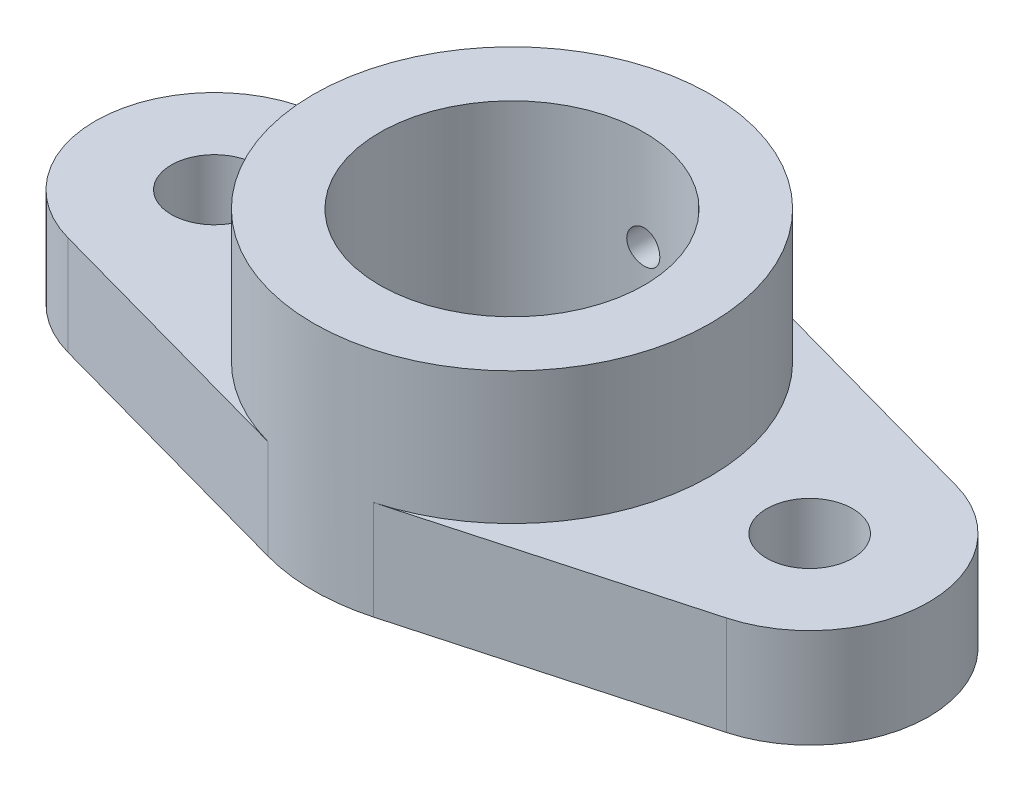
ISO-10303-21;
HEADER;
FILE_DESCRIPTION(('STEP AP214'),'2;1');
FILE_NAME('part.step','',(''),(''),'','','');
FILE_SCHEMA(('AUTOMOTIVE_DESIGN { 1 0 10303 214 1 1 1 1 }'));
ENDSEC;
DATA;
#1=APPLICATION_CONTEXT('core data for automotive mechanical design processes');
#2=APPLICATION_PROTOCOL_DEFINITION('international standard','automotive_design',2000,#1);
#3=PRODUCT_CONTEXT('',#1,'mechanical');
#4=PRODUCT('Part','Part','',(#3));
#5=PRODUCT_RELATED_PRODUCT_CATEGORY('part','',(#4));
#6=PRODUCT_DEFINITION_FORMATION('','',#4);
#7=PRODUCT_DEFINITION_CONTEXT('part definition',#1,'design');
#8=PRODUCT_DEFINITION('design','',#6,#7);
#9=PRODUCT_DEFINITION_SHAPE('','',#8);
#10=(LENGTH_UNIT() NAMED_UNIT(*) SI_UNIT(.MILLI.,.METRE.));
#11=(NAMED_UNIT(*) PLANE_ANGLE_UNIT() SI_UNIT($,.RADIAN.));
#12=(NAMED_UNIT(*) SI_UNIT($,.STERADIAN.) SOLID_ANGLE_UNIT());
#13=UNCERTAINTY_MEASURE_WITH_UNIT(LENGTH_MEASURE(1.E-05),#10,'distance_accuracy_value','');
#14=(GEOMETRIC_REPRESENTATION_CONTEXT(3) GLOBAL_UNCERTAINTY_ASSIGNED_CONTEXT((#13)) GLOBAL_UNIT_ASSIGNED_CONTEXT((#10,
#11,#12)) REPRESENTATION_CONTEXT('',''));
#15=CARTESIAN_POINT('',(0.,0.,0.));
#16=DIRECTION('',(0.,0.,1.));
#17=DIRECTION('',(1.,0.,0.));
#18=AXIS2_PLACEMENT_3D('',#15,#16,#17);
#19=CARTESIAN_POINT('',(-45.,15.,0.));
#20=DIRECTION('',(0.,1.,0.));
#21=DIRECTION('',(0.,0.,1.));
#22=AXIS2_PLACEMENT_3D('',#19,#20,#21);
#23=PLANE('',#22);
#24=CARTESIAN_POINT('',(0.,15.,0.));
#25=DIRECTION('',(0.,1.,0.));
#26=DIRECTION('',(0.,0.,1.));
#27=AXIS2_PLACEMENT_3D('',#24,#25,#26);
#28=CIRCLE('',#27,30.);
#29=CARTESIAN_POINT('',(8.,15.,28.9136645896019));
#30=VERTEX_POINT('',#29);
#31=CARTESIAN_POINT('',(8.00000000000001,15.,-28.9136645896019));
#32=VERTEX_POINT('',#31);
#33=EDGE_CURVE('E63',#30,#32,#28,.T.);
#34=ORIENTED_EDGE('',*,*,#33,.F.);
#35=DIRECTION('',(0.963788819653397,0.,-0.266666666666667));
#36=VECTOR('',#35,1.);
#37=CARTESIAN_POINT('',(49.8,15.,17.3481987537612));
#38=LINE('',#37,#36);
#39=CARTESIAN_POINT('',(49.8,15.,17.3481987537612));
#40=VERTEX_POINT('',#39);
#41=EDGE_CURVE('E186',#30,#40,#38,.T.);
#42=ORIENTED_EDGE('',*,*,#41,.T.);
#43=CARTESIAN_POINT('',(45.,15.,0.));
#44=DIRECTION('',(0.,1.,0.));
#45=DIRECTION('',(0.,0.,-1.));
#46=AXIS2_PLACEMENT_3D('',#43,#44,#45);
#47=CIRCLE('',#46,18.);
#48=CARTESIAN_POINT('',(49.8,15.,-17.3481987537612));
#49=VERTEX_POINT('',#48);
#50=EDGE_CURVE('E134',#40,#49,#47,.T.);
#51=ORIENTED_EDGE('',*,*,#50,.T.);
#52=DIRECTION('',(-0.963788819653397,0.,-0.266666666666667));
#53=VECTOR('',#52,1.);
#54=CARTESIAN_POINT('',(49.8,15.,-17.3481987537612));
#55=LINE('',#54,#53);
#56=EDGE_CURVE('E129',#49,#32,#55,.T.);
#57=ORIENTED_EDGE('',*,*,#56,.T.);
#58=EDGE_LOOP('',(#34,#42,#51,#57));
#59=FACE_BOUND('',#58,.T.);
#60=CARTESIAN_POINT('',(45.,15.,0.));
#61=DIRECTION('',(0.,1.,0.));
#62=DIRECTION('',(0.,0.,-1.));
#63=AXIS2_PLACEMENT_3D('',#60,#61,#62);
#64=CIRCLE('',#63,6.5);
#65=CARTESIAN_POINT('',(45.,15.,-6.5));
#66=VERTEX_POINT('',#65);
#67=EDGE_CURVE('E165',#66,#66,#64,.T.);
#68=ORIENTED_EDGE('',*,*,#67,.F.);
#69=EDGE_LOOP('',(#68));
#70=FACE_BOUND('',#69,.T.);
#71=ADVANCED_FACE('F45',(#59,#70),#23,.T.);
#72=CARTESIAN_POINT('',(-8.,15.,-28.9136645896019));
#73=VERTEX_POINT('',#72);
#74=CARTESIAN_POINT('',(-8.00000000000001,15.,28.9136645896019));
#75=VERTEX_POINT('',#74);
#76=EDGE_CURVE('E11',#73,#75,#28,.T.);
#77=ORIENTED_EDGE('',*,*,#76,.F.);
#78=DIRECTION('',(-0.963788819653397,0.,0.266666666666667));
#79=VECTOR('',#78,1.);
#80=CARTESIAN_POINT('',(-49.8,15.,-17.3481987537612));
#81=LINE('',#80,#79);
#82=CARTESIAN_POINT('',(-49.8,15.,-17.3481987537612));
#83=VERTEX_POINT('',#82);
#84=EDGE_CURVE('E71',#73,#83,#81,.T.);
#85=ORIENTED_EDGE('',*,*,#84,.T.);
#86=CARTESIAN_POINT('',(-45.,15.,0.));
#87=DIRECTION('',(0.,1.,0.));
#88=DIRECTION('',(0.,0.,1.));
#89=AXIS2_PLACEMENT_3D('',#86,#87,#88);
#90=CIRCLE('',#89,18.);
#91=CARTESIAN_POINT('',(-49.8,15.,17.3481987537612));
#92=VERTEX_POINT('',#91);
#93=EDGE_CURVE('E181',#83,#92,#90,.T.);
#94=ORIENTED_EDGE('',*,*,#93,.T.);
#95=DIRECTION('',(0.963788819653397,0.,0.266666666666667));
#96=VECTOR('',#95,1.);
#97=CARTESIAN_POINT('',(-49.8,15.,17.3481987537612));
#98=LINE('',#97,#96);
#99=EDGE_CURVE('E116',#92,#75,#98,.T.);
#100=ORIENTED_EDGE('',*,*,#99,.T.);
#101=EDGE_LOOP('',(#77,#85,#94,#100));
#102=FACE_BOUND('',#101,.T.);
#103=CARTESIAN_POINT('',(-45.,15.,0.));
#104=DIRECTION('',(0.,1.,0.));
#105=DIRECTION('',(0.,0.,1.));
#106=AXIS2_PLACEMENT_3D('',#103,#104,#105);
#107=CIRCLE('',#106,6.5);
#108=CARTESIAN_POINT('',(-45.,15.,6.5));
#109=VERTEX_POINT('',#108);
#110=EDGE_CURVE('E173',#109,#109,#107,.T.);
#111=ORIENTED_EDGE('',*,*,#110,.F.);
#112=EDGE_LOOP('',(#111));
#113=FACE_BOUND('',#112,.T.);
#114=ADVANCED_FACE('F258',(#102,#113),#23,.T.);
#115=CARTESIAN_POINT('',(-45.,0.,0.));
#116=DIRECTION('',(0.,1.,0.));
#117=DIRECTION('',(0.,0.,1.));
#118=AXIS2_PLACEMENT_3D('',#115,#116,#117);
#119=PLANE('',#118);
#120=CARTESIAN_POINT('',(0.,0.,0.));
#121=DIRECTION('',(0.,1.,0.));
#122=DIRECTION('',(0.,0.,1.));
#123=AXIS2_PLACEMENT_3D('',#120,#121,#122);
#124=CIRCLE('',#123,20.);
#125=CARTESIAN_POINT('',(0.,0.,20.));
#126=VERTEX_POINT('',#125);
#127=EDGE_CURVE('E155',#126,#126,#124,.T.);
#128=ORIENTED_EDGE('',*,*,#127,.T.);
#129=EDGE_LOOP('',(#128));
#130=FACE_BOUND('',#129,.T.);
#131=CARTESIAN_POINT('',(-45.,0.,0.));
#132=DIRECTION('',(0.,1.,0.));
#133=DIRECTION('',(0.,0.,1.));
#134=AXIS2_PLACEMENT_3D('',#131,#132,#133);
#135=CIRCLE('',#134,18.);
#136=CARTESIAN_POINT('',(-49.8,0.,-17.3481987537612));
#137=VERTEX_POINT('',#136);
#138=CARTESIAN_POINT('',(-49.8,0.,17.3481987537612));
#139=VERTEX_POINT('',#138);
#140=EDGE_CURVE('E177',#137,#139,#135,.T.);
#141=ORIENTED_EDGE('',*,*,#140,.F.);
#142=DIRECTION('',(-0.963788819653397,0.,0.266666666666667));
#143=VECTOR('',#142,1.);
#144=CARTESIAN_POINT('',(-49.8,0.,-17.3481987537612));
#145=LINE('',#144,#143);
#146=CARTESIAN_POINT('',(-8.,0.,-28.9136645896019));
#147=VERTEX_POINT('',#146);
#148=EDGE_CURVE('E107',#147,#137,#145,.T.);
#149=ORIENTED_EDGE('',*,*,#148,.F.);
#150=CARTESIAN_POINT('',(0.,0.,0.));
#151=DIRECTION('',(0.,1.,0.));
#152=DIRECTION('',(0.,0.,1.));
#153=AXIS2_PLACEMENT_3D('',#150,#151,#152);
#154=CIRCLE('',#153,30.);
#155=CARTESIAN_POINT('',(8.00000000000001,0.,-28.9136645896019));
#156=VERTEX_POINT('',#155);
#157=EDGE_CURVE('E101',#156,#147,#154,.T.);
#158=ORIENTED_EDGE('',*,*,#157,.F.);
#159=DIRECTION('',(-0.963788819653397,0.,-0.266666666666667));
#160=VECTOR('',#159,1.);
#161=CARTESIAN_POINT('',(49.8,0.,-17.3481987537612));
#162=LINE('',#161,#160);
#163=CARTESIAN_POINT('',(49.8,0.,-17.3481987537612));
#164=VERTEX_POINT('',#163);
#165=EDGE_CURVE('E143',#164,#156,#162,.T.);
#166=ORIENTED_EDGE('',*,*,#165,.F.);
#167=CARTESIAN_POINT('',(45.,0.,0.));
#168=DIRECTION('',(0.,1.,0.));
#169=DIRECTION('',(0.,0.,-1.));
#170=AXIS2_PLACEMENT_3D('',#167,#168,#169);
#171=CIRCLE('',#170,18.);
#172=CARTESIAN_POINT('',(49.8,0.,17.3481987537612));
#173=VERTEX_POINT('',#172);
#174=EDGE_CURVE('E206',#173,#164,#171,.T.);
#175=ORIENTED_EDGE('',*,*,#174,.F.);
#176=DIRECTION('',(0.963788819653397,0.,-0.266666666666667));
#177=VECTOR('',#176,1.);
#178=CARTESIAN_POINT('',(49.8,0.,17.3481987537612));
#179=LINE('',#178,#177);
#180=CARTESIAN_POINT('',(8.,0.,28.9136645896019));
#181=VERTEX_POINT('',#180);
#182=EDGE_CURVE('E203',#181,#173,#179,.T.);
#183=ORIENTED_EDGE('',*,*,#182,.F.);
#184=CARTESIAN_POINT('',(0.,0.,0.));
#185=DIRECTION('',(0.,1.,0.));
#186=DIRECTION('',(0.,0.,1.));
#187=AXIS2_PLACEMENT_3D('',#184,#185,#186);
#188=CIRCLE('',#187,30.);
#189=CARTESIAN_POINT('',(-8.00000000000001,0.,28.9136645896019));
#190=VERTEX_POINT('',#189);
#191=EDGE_CURVE('E200',#190,#181,#188,.T.);
#192=ORIENTED_EDGE('',*,*,#191,.F.);
#193=DIRECTION('',(0.963788819653397,0.,0.266666666666667));
#194=VECTOR('',#193,1.);
#195=CARTESIAN_POINT('',(-49.8,0.,17.3481987537612));
#196=LINE('',#195,#194);
#197=EDGE_CURVE('E197',#139,#190,#196,.T.);
#198=ORIENTED_EDGE('',*,*,#197,.F.);
#199=EDGE_LOOP('',(#141,#149,#158,#166,#175,#183,#192,#198));
#200=FACE_BOUND('',#199,.T.);
#201=CARTESIAN_POINT('',(-45.,0.,0.));
#202=DIRECTION('',(0.,1.,0.));
#203=DIRECTION('',(0.,0.,1.));
#204=AXIS2_PLACEMENT_3D('',#201,#202,#203);
#205=CIRCLE('',#204,6.5);
#206=CARTESIAN_POINT('',(-45.,0.,6.5));
#207=VERTEX_POINT('',#206);
#208=EDGE_CURVE('E169',#207,#207,#205,.T.);
#209=ORIENTED_EDGE('',*,*,#208,.T.);
#210=EDGE_LOOP('',(#209));
#211=FACE_BOUND('',#210,.T.);
#212=CARTESIAN_POINT('',(45.,0.,0.));
#213=DIRECTION('',(0.,1.,0.));
#214=DIRECTION('',(0.,0.,-1.));
#215=AXIS2_PLACEMENT_3D('',#212,#213,#214);
#216=CIRCLE('',#215,6.5);
#217=CARTESIAN_POINT('',(45.,0.,-6.5));
#218=VERTEX_POINT('',#217);
#219=EDGE_CURVE('E159',#218,#218,#216,.T.);
#220=ORIENTED_EDGE('',*,*,#219,.T.);
#221=EDGE_LOOP('',(#220));
#222=FACE_BOUND('',#221,.T.);
#223=ADVANCED_FACE('F237',(#130,#200,#211,#222),#119,.F.);
#224=CARTESIAN_POINT('',(-45.,15.,0.));
#225=DIRECTION('',(0.,-1.,0.));
#226=DIRECTION('',(0.,0.,-1.));
#227=AXIS2_PLACEMENT_3D('',#224,#225,#226);
#228=CYLINDRICAL_SURFACE('',#227,18.);
#229=ORIENTED_EDGE('',*,*,#140,.T.);
#230=DIRECTION('',(0.,-1.,0.));
#231=VECTOR('',#230,1.);
#232=CARTESIAN_POINT('',(-49.8,15.,17.3481987537612));
#233=LINE('',#232,#231);
#234=EDGE_CURVE('E61',#92,#139,#233,.T.);
#235=ORIENTED_EDGE('',*,*,#234,.F.);
#236=ORIENTED_EDGE('',*,*,#93,.F.);
#237=DIRECTION('',(0.,-1.,0.));
#238=VECTOR('',#237,1.);
#239=CARTESIAN_POINT('',(-49.8,15.,-17.3481987537612));
#240=LINE('',#239,#238);
#241=EDGE_CURVE('E193',#83,#137,#240,.T.);
#242=ORIENTED_EDGE('',*,*,#241,.T.);
#243=EDGE_LOOP('',(#229,#235,#236,#242));
#244=FACE_BOUND('',#243,.T.);
#245=ADVANCED_FACE('F47',(#244),#228,.T.);
#246=CARTESIAN_POINT('',(-49.8,15.,17.3481987537612));
#247=DIRECTION('',(0.266666666666667,0.,-0.963788819653397));
#248=DIRECTION('',(-0.963788819653397,0.,-0.266666666666667));
#249=AXIS2_PLACEMENT_3D('',#246,#247,#248);
#250=PLANE('',#249);
#251=ORIENTED_EDGE('',*,*,#197,.T.);
#252=DIRECTION('',(0.,-1.,0.));
#253=VECTOR('',#252,1.);
#254=CARTESIAN_POINT('',(-8.00000000000001,15.,28.9136645896019));
#255=LINE('',#254,#253);
#256=EDGE_CURVE('E227',#75,#190,#255,.T.);
#257=ORIENTED_EDGE('',*,*,#256,.F.);
#258=ORIENTED_EDGE('',*,*,#99,.F.);
#259=ORIENTED_EDGE('',*,*,#234,.T.);
#260=EDGE_LOOP('',(#251,#257,#258,#259));
#261=FACE_BOUND('',#260,.T.);
#262=ADVANCED_FACE('F232',(#261),#250,.F.);
#263=CARTESIAN_POINT('',(49.8,15.,17.3481987537612));
#264=DIRECTION('',(-0.266666666666667,0.,-0.963788819653397));
#265=DIRECTION('',(-0.963788819653397,0.,0.266666666666667));
#266=AXIS2_PLACEMENT_3D('',#263,#264,#265);
#267=PLANE('',#266);
#268=ORIENTED_EDGE('',*,*,#182,.T.);
#269=DIRECTION('',(0.,-1.,0.));
#270=VECTOR('',#269,1.);
#271=CARTESIAN_POINT('',(49.8,15.,17.3481987537612));
#272=LINE('',#271,#270);
#273=EDGE_CURVE('E221',#40,#173,#272,.T.);
#274=ORIENTED_EDGE('',*,*,#273,.F.);
#275=ORIENTED_EDGE('',*,*,#41,.F.);
#276=DIRECTION('',(0.,-1.,0.));
#277=VECTOR('',#276,1.);
#278=CARTESIAN_POINT('',(8.,15.,28.9136645896019));
#279=LINE('',#278,#277);
#280=EDGE_CURVE('E152',#30,#181,#279,.T.);
#281=ORIENTED_EDGE('',*,*,#280,.T.);
#282=EDGE_LOOP('',(#268,#274,#275,#281));
#283=FACE_BOUND('',#282,.T.);
#284=ADVANCED_FACE('F244',(#283),#267,.F.);
#285=CARTESIAN_POINT('',(45.,15.,0.));
#286=DIRECTION('',(0.,-1.,0.));
#287=DIRECTION('',(0.,0.,-1.));
#288=AXIS2_PLACEMENT_3D('',#285,#286,#287);
#289=CYLINDRICAL_SURFACE('',#288,18.);
#290=ORIENTED_EDGE('',*,*,#174,.T.);
#291=DIRECTION('',(0.,-1.,0.));
#292=VECTOR('',#291,1.);
#293=CARTESIAN_POINT('',(49.8,15.,-17.3481987537612));
#294=LINE('',#293,#292);
#295=EDGE_CURVE('E145',#49,#164,#294,.T.);
#296=ORIENTED_EDGE('',*,*,#295,.F.);
#297=ORIENTED_EDGE('',*,*,#50,.F.);
#298=ORIENTED_EDGE('',*,*,#273,.T.);
#299=EDGE_LOOP('',(#290,#296,#297,#298));
#300=FACE_BOUND('',#299,.T.);
#301=ADVANCED_FACE('F247',(#300),#289,.T.);
#302=CARTESIAN_POINT('',(49.8,15.,-17.3481987537612));
#303=DIRECTION('',(-0.266666666666667,0.,0.963788819653397));
#304=DIRECTION('',(0.963788819653397,0.,0.266666666666667));
#305=AXIS2_PLACEMENT_3D('',#302,#303,#304);
#306=PLANE('',#305);
#307=ORIENTED_EDGE('',*,*,#165,.T.);
#308=DIRECTION('',(0.,-1.,0.));
#309=VECTOR('',#308,1.);
#310=CARTESIAN_POINT('',(8.00000000000001,15.,-28.9136645896019));
#311=LINE('',#310,#309);
#312=EDGE_CURVE('E140',#32,#156,#311,.T.);
#313=ORIENTED_EDGE('',*,*,#312,.F.);
#314=ORIENTED_EDGE('',*,*,#56,.F.);
#315=ORIENTED_EDGE('',*,*,#295,.T.);
#316=EDGE_LOOP('',(#307,#313,#314,#315));
#317=FACE_BOUND('',#316,.T.);
#318=ADVANCED_FACE('F141',(#317),#306,.F.);
#319=CARTESIAN_POINT('',(0.,15.,0.));
#320=DIRECTION('',(0.,-1.,0.));
#321=DIRECTION('',(0.,0.,-1.));
#322=AXIS2_PLACEMENT_3D('',#319,#320,#321);
#323=CYLINDRICAL_SURFACE('',#322,30.);
#324=CARTESIAN_POINT('',(0.,22.5,-30.));
#325=CARTESIAN_POINT('',(-0.140165224803011,22.4999938779343,-29.9999986352879));
#326=CARTESIAN_POINT('',(-0.280425867950564,22.4881725754724,-29.9990072135849));
#327=CARTESIAN_POINT('',(-0.557066426750974,22.4411891203623,-29.9951475582063));
#328=CARTESIAN_POINT('',(-0.693441763063075,22.4060005242377,-29.9922771982924));
#329=CARTESIAN_POINT('',(-0.958265056285652,22.3133071154766,-29.9849840311526));
#330=CARTESIAN_POINT('',(-1.08671745106154,22.2558149297255,-29.9805621024621));
#331=CARTESIAN_POINT('',(-1.33211808354019,22.12016892032,-29.9706616936178));
#332=CARTESIAN_POINT('',(-1.44906877471347,22.0420195163062,-29.965183439534));
#333=CARTESIAN_POINT('',(-1.66847499991398,21.867062333485,-29.9537694966678));
#334=CARTESIAN_POINT('',(-1.7708971810404,21.7702127901608,-29.9478328021644));
#335=CARTESIAN_POINT('',(-1.95805283384138,21.5606927603752,-29.9361795200792));
#336=CARTESIAN_POINT('',(-2.04278552842876,21.4480215792434,-29.930462942176));
#337=CARTESIAN_POINT('',(-2.19226980597557,21.2098547072524,-29.9198863165311));
#338=CARTESIAN_POINT('',(-2.25699208237886,21.0843405614931,-29.9150275295023));
#339=CARTESIAN_POINT('',(-2.36443108443461,20.82417926111,-29.9067281112068));
#340=CARTESIAN_POINT('',(-2.40714819878104,20.6895322678544,-29.9032874548908));
#341=CARTESIAN_POINT('',(-2.46926757454643,20.4152615202971,-29.8982223016581));
#342=CARTESIAN_POINT('',(-2.48872416347444,20.2756501500185,-29.8965935734055));
#343=CARTESIAN_POINT('',(-2.50393802003857,19.9951344901366,-29.8953233080369));
#344=CARTESIAN_POINT('',(-2.49969573244885,19.8542302248475,-29.8956817336265));
#345=CARTESIAN_POINT('',(-2.46767716053712,19.5755008362237,-29.8983414340409));
#346=CARTESIAN_POINT('',(-2.43995992009514,19.437668877309,-29.9006378344463));
#347=CARTESIAN_POINT('',(-2.36186996345735,19.1686203315176,-29.9069070892341));
#348=CARTESIAN_POINT('',(-2.31149702599196,19.0374038092654,-29.91087995999));
#349=CARTESIAN_POINT('',(-2.18945947038008,18.7851227353048,-29.9200601176713));
#350=CARTESIAN_POINT('',(-2.11776836189298,18.6640710560312,-29.9252689387741));
#351=CARTESIAN_POINT('',(-1.95514860978337,18.4356966529505,-29.936332671597));
#352=CARTESIAN_POINT('',(-1.86421957655635,18.328374207257,-29.9421875964008));
#353=CARTESIAN_POINT('',(-1.6653739555659,18.1301614517961,-29.9539055102911));
#354=CARTESIAN_POINT('',(-1.55740632347644,18.0393223396769,-29.9597684693767));
#355=CARTESIAN_POINT('',(-1.32772639092938,17.8770506915286,-29.9708247967459));
#356=CARTESIAN_POINT('',(-1.20601408128834,17.8056181684661,-29.9760181645821));
#357=CARTESIAN_POINT('',(-0.952266483169628,17.6841905933282,-29.985151145241));
#358=CARTESIAN_POINT('',(-0.820230104522685,17.6341978088046,-29.9890906254361));
#359=CARTESIAN_POINT('',(-0.549597672548954,17.5571046688717,-29.995270435295));
#360=CARTESIAN_POINT('',(-0.411001755422137,17.5300038383618,-29.9975108002222));
#361=CARTESIAN_POINT('',(-0.131628250410627,17.4995280898961,-30.0000354235763));
#362=CARTESIAN_POINT('',(0.0091415727879907,17.4960824547328,-30.0003255123001));
#363=CARTESIAN_POINT('',(0.289256881258259,17.5128296515683,-29.9989324694675));
#364=CARTESIAN_POINT('',(0.428602379803533,17.5330222630737,-29.9972493563169));
#365=CARTESIAN_POINT('',(0.701711890561749,17.5964141465252,-29.992102946033));
#366=CARTESIAN_POINT('',(0.835483562849305,17.6395806400645,-29.9886421854355));
#367=CARTESIAN_POINT('',(1.09388541270622,17.7476614694551,-29.9803292528088));
#368=CARTESIAN_POINT('',(1.21851544570783,17.8125761491463,-29.9754770587811));
#369=CARTESIAN_POINT('',(1.45541804575477,17.9624883730409,-29.9649106598408));
#370=CARTESIAN_POINT('',(1.56766087630367,18.0475327659871,-29.9591944554684));
#371=CARTESIAN_POINT('',(1.77630273710905,18.2352226426262,-29.9475489659924));
#372=CARTESIAN_POINT('',(1.87270149203596,18.3378684321232,-29.9416196771882));
#373=CARTESIAN_POINT('',(2.04716136363776,18.5581542304959,-29.9301990303956));
#374=CARTESIAN_POINT('',(2.12517633308409,18.6758308529935,-29.9247087968556));
#375=CARTESIAN_POINT('',(2.26033765709879,18.9226556571585,-29.914803793608));
#376=CARTESIAN_POINT('',(2.31748422002491,19.0518037242749,-29.9103890131629));
#377=CARTESIAN_POINT('',(2.40920794360141,19.3177419763481,-29.9031410712235));
#378=CARTESIAN_POINT('',(2.44381335362322,19.4545223617858,-29.9003059307159));
#379=CARTESIAN_POINT('',(2.48956442477538,19.7319767496861,-29.8965316422713));
#380=CARTESIAN_POINT('',(2.50071053642066,19.872650677324,-29.8955924579242));
#381=CARTESIAN_POINT('',(2.49922140722733,20.1534403150522,-29.8957169487549));
#382=CARTESIAN_POINT('',(2.48665867444348,20.2935564180911,-29.8967745173267));
#383=CARTESIAN_POINT('',(2.43825965823758,20.5696813338771,-29.9007603770577));
#384=CARTESIAN_POINT('',(2.40242333931907,20.7056901403596,-29.9036886710699));
#385=CARTESIAN_POINT('',(2.30851277504265,20.9697444081666,-29.9110844282926));
#386=CARTESIAN_POINT('',(2.25043983501633,21.0977903364142,-29.9155518011547));
#387=CARTESIAN_POINT('',(2.11371264736812,21.3423271014342,-29.9255224968768));
#388=CARTESIAN_POINT('',(2.03505872278639,21.4588181195333,-29.9310258034762));
#389=CARTESIAN_POINT('',(1.85912985530612,21.6773093475325,-29.942468292467));
#390=CARTESIAN_POINT('',(1.76180123435365,21.7792662716434,-29.9484087001436));
#391=CARTESIAN_POINT('',(1.55138306398116,21.9654379630083,-29.960044875242));
#392=CARTESIAN_POINT('',(1.43828970660273,22.04964843124,-29.9657405831206));
#393=CARTESIAN_POINT('',(1.19933443257354,22.1980496510439,-29.9762558710569));
#394=CARTESIAN_POINT('',(1.07344914067634,22.2622028466408,-29.9810738005776));
#395=CARTESIAN_POINT('',(0.812739379989333,22.3683795076282,-29.9892713129075));
#396=CARTESIAN_POINT('',(0.677925388534127,22.4104284107203,-29.9926525482064));
#397=CARTESIAN_POINT('',(0.451930120241698,22.4604939562551,-29.9967276933463));
#398=CARTESIAN_POINT('',(0.362202236096177,22.4752890312937,-29.9979492219238));
#399=CARTESIAN_POINT('',(0.181662928752907,22.495044024193,-29.9995858164658));
#400=CARTESIAN_POINT('',(0.0908515084326128,22.5000039681662,-30.0000008845714));
#401=CARTESIAN_POINT('',(0.,22.5,-30.));
#402=B_SPLINE_CURVE_WITH_KNOTS('',3,(#324,#325,#326,#327,#328,#329,#330,#331,#332,#333,#334,
#335,#336,#337,#338,#339,#340,#341,#342,#343,#344,#345,#346,#347,#348,#349,#350,#351,#352,#353,
#354,#355,#356,#357,#358,#359,#360,#361,#362,#363,#364,#365,#366,#367,#368,#369,#370,#371,#372,
#373,#374,#375,#376,#377,#378,#379,#380,#381,#382,#383,#384,#385,#386,#387,#388,#389,#390,#391,
#392,#393,#394,#395,#396,#397,#398,#399,#400,#401),.UNSPECIFIED.,.T.,.F.,(4,2,2,2,2,2,2,2,2,2,2,
2,2,2,2,2,2,2,2,2,2,2,2,2,2,2,2,2,2,2,2,2,2,2,2,2,2,2,4),(0.,0.420163967000348,
0.840804222494588,1.26120668472239,1.68151927396045,2.10278167196441,2.52406257184829,
2.94595757377728,3.36784512319752,3.78874537078966,4.20963771906547,4.62947457775724,
5.04931553692497,5.46968039372248,5.89005376452151,6.31171127337874,6.73336906396612,
7.15507143976126,7.57676506331337,7.99719748267921,8.41762598035553,8.83745622576963,
9.2572931090343,9.67811687437317,10.0989479517813,10.5208244122801,10.9426966604957,
11.3640391810232,11.7853736099689,12.2054215720632,12.6254701748085,13.0454941236881,
13.4655114802464,13.886754716616,14.308099880812,14.7302293265638,15.1518719147946,
15.4242121589166,15.6965516799687),.UNSPECIFIED.);
#403=CARTESIAN_POINT('',(0.,22.5,-30.));
#404=VERTEX_POINT('',#403);
#405=EDGE_CURVE('E278',#404,#404,#402,.T.);
#406=ORIENTED_EDGE('',*,*,#405,.T.);
#407=EDGE_LOOP('',(#406));
#408=FACE_BOUND('',#407,.T.);
#409=ORIENTED_EDGE('',*,*,#157,.T.);
#410=DIRECTION('',(0.,-1.,0.));
#411=VECTOR('',#410,1.);
#412=CARTESIAN_POINT('',(-8.,15.,-28.9136645896019));
#413=LINE('',#412,#411);
#414=EDGE_CURVE('E146',#73,#147,#413,.T.);
#415=ORIENTED_EDGE('',*,*,#414,.F.);
#416=ORIENTED_EDGE('',*,*,#76,.T.);
#417=ORIENTED_EDGE('',*,*,#256,.T.);
#418=ORIENTED_EDGE('',*,*,#191,.T.);
#419=ORIENTED_EDGE('',*,*,#280,.F.);
#420=ORIENTED_EDGE('',*,*,#33,.T.);
#421=ORIENTED_EDGE('',*,*,#312,.T.);
#422=EDGE_LOOP('',(#409,#415,#416,#417,#418,#419,#420,#421));
#423=FACE_BOUND('',#422,.T.);
#424=CARTESIAN_POINT('',(0.,35.,0.));
#425=DIRECTION('',(0.,1.,0.));
#426=DIRECTION('',(0.,0.,1.));
#427=AXIS2_PLACEMENT_3D('',#424,#425,#426);
#428=CIRCLE('',#427,30.);
#429=CARTESIAN_POINT('',(0.,35.,30.));
#430=VERTEX_POINT('',#429);
#431=EDGE_CURVE('E154',#430,#430,#428,.T.);
#432=ORIENTED_EDGE('',*,*,#431,.F.);
#433=EDGE_LOOP('',(#432));
#434=FACE_BOUND('',#433,.T.);
#435=ADVANCED_FACE('F149',(#408,#423,#434),#323,.T.);
#436=CARTESIAN_POINT('',(-49.8,15.,-17.3481987537612));
#437=DIRECTION('',(0.266666666666667,0.,0.963788819653397));
#438=DIRECTION('',(0.963788819653397,0.,-0.266666666666667));
#439=AXIS2_PLACEMENT_3D('',#436,#437,#438);
#440=PLANE('',#439);
#441=ORIENTED_EDGE('',*,*,#148,.T.);
#442=ORIENTED_EDGE('',*,*,#241,.F.);
#443=ORIENTED_EDGE('',*,*,#84,.F.);
#444=ORIENTED_EDGE('',*,*,#414,.T.);
#445=EDGE_LOOP('',(#441,#442,#443,#444));
#446=FACE_BOUND('',#445,.T.);
#447=ADVANCED_FACE('F271',(#446),#440,.F.);
#448=CARTESIAN_POINT('',(-45.,15.,0.));
#449=DIRECTION('',(0.,-1.,0.));
#450=DIRECTION('',(0.,0.,-1.));
#451=AXIS2_PLACEMENT_3D('',#448,#449,#450);
#452=CYLINDRICAL_SURFACE('',#451,6.5);
#453=ORIENTED_EDGE('',*,*,#110,.T.);
#454=EDGE_LOOP('',(#453));
#455=FACE_BOUND('',#454,.T.);
#456=ORIENTED_EDGE('',*,*,#208,.F.);
#457=EDGE_LOOP('',(#456));
#458=FACE_BOUND('',#457,.T.);
#459=ADVANCED_FACE('F266',(#455,#458),#452,.F.);
#460=CARTESIAN_POINT('',(45.,15.,0.));
#461=DIRECTION('',(0.,-1.,0.));
#462=DIRECTION('',(0.,0.,-1.));
#463=AXIS2_PLACEMENT_3D('',#460,#461,#462);
#464=CYLINDRICAL_SURFACE('',#463,6.5);
#465=ORIENTED_EDGE('',*,*,#67,.T.);
#466=EDGE_LOOP('',(#465));
#467=FACE_BOUND('',#466,.T.);
#468=ORIENTED_EDGE('',*,*,#219,.F.);
#469=EDGE_LOOP('',(#468));
#470=FACE_BOUND('',#469,.T.);
#471=ADVANCED_FACE('F297',(#467,#470),#464,.F.);
#472=CARTESIAN_POINT('',(0.,35.,0.));
#473=DIRECTION('',(0.,1.,0.));
#474=DIRECTION('',(0.,0.,1.));
#475=AXIS2_PLACEMENT_3D('',#472,#473,#474);
#476=PLANE('',#475);
#477=CARTESIAN_POINT('',(0.,35.,0.));
#478=DIRECTION('',(0.,1.,0.));
#479=DIRECTION('',(0.,0.,1.));
#480=AXIS2_PLACEMENT_3D('',#477,#478,#479);
#481=CIRCLE('',#480,20.);
#482=CARTESIAN_POINT('',(0.,35.,20.));
#483=VERTEX_POINT('',#482);
#484=EDGE_CURVE('E162',#483,#483,#481,.T.);
#485=ORIENTED_EDGE('',*,*,#484,.F.);
#486=EDGE_LOOP('',(#485));
#487=FACE_BOUND('',#486,.T.);
#488=ORIENTED_EDGE('',*,*,#431,.T.);
#489=EDGE_LOOP('',(#488));
#490=FACE_BOUND('',#489,.T.);
#491=ADVANCED_FACE('F294',(#487,#490),#476,.T.);
#492=CARTESIAN_POINT('',(0.,-48.,0.));
#493=DIRECTION('',(0.,1.,0.));
#494=DIRECTION('',(0.,0.,1.));
#495=AXIS2_PLACEMENT_3D('',#492,#493,#494);
#496=CYLINDRICAL_SURFACE('',#495,20.);
#497=CARTESIAN_POINT('',(-2.5,20.,-19.8431348329844));
#498=CARTESIAN_POINT('',(-2.49999405483338,20.1398362838005,-19.8431368414673));
#499=CARTESIAN_POINT('',(-2.48822789901659,20.2797599649306,-19.8446289499888));
#500=CARTESIAN_POINT('',(-2.44147641371667,20.5557132254285,-19.8504339085542));
#501=CARTESIAN_POINT('',(-2.4064668210908,20.6917385805018,-19.8547497060959));
#502=CARTESIAN_POINT('',(-2.31427669282773,20.9558598821076,-19.8657057380876));
#503=CARTESIAN_POINT('',(-2.25711120479872,21.0839611421164,-19.8723443946258));
#504=CARTESIAN_POINT('',(-2.12226419842905,21.3287284518253,-19.8871962351098));
#505=CARTESIAN_POINT('',(-2.04458618737466,21.4453964517437,-19.8954091498188));
#506=CARTESIAN_POINT('',(-1.87045345026455,21.6646622471215,-19.9125355924631));
#507=CARTESIAN_POINT('',(-1.77390681502433,21.7671868023187,-19.9214524170269));
#508=CARTESIAN_POINT('',(-1.56497526067119,21.9546227689392,-19.9389523287519));
#509=CARTESIAN_POINT('',(-1.45258955405802,22.0395333040947,-19.9475353992921));
#510=CARTESIAN_POINT('',(-1.21470983067598,22.1895935795063,-19.96343444613));
#511=CARTESIAN_POINT('',(-1.08917369556112,22.2546770450997,-19.9707461384685));
#512=CARTESIAN_POINT('',(-0.828846718055914,22.362811199941,-19.9832423695448));
#513=CARTESIAN_POINT('',(-0.694056219360903,22.4058627069265,-19.9884269872296));
#514=CARTESIAN_POINT('',(-0.419795687751112,22.4684920683344,-19.9960616870624));
#515=CARTESIAN_POINT('',(-0.280353859663377,22.4881916785239,-19.9985259483594));
#516=CARTESIAN_POINT('',(-0.000123200686545383,22.5039353850365,-20.0004906972921));
#517=CARTESIAN_POINT('',(0.140665576994772,22.4999804119525,-19.9999913015208));
#518=CARTESIAN_POINT('',(0.418765268974549,22.4686247972426,-19.9960964777001));
#519=CARTESIAN_POINT('',(0.556091205764455,22.4413551015186,-19.9927172245573));
#520=CARTESIAN_POINT('',(0.824202163905378,22.3643488233701,-19.9834605594233));
#521=CARTESIAN_POINT('',(0.954987060856207,22.3146118138332,-19.9775830999405));
#522=CARTESIAN_POINT('',(1.20670881543864,22.1939435072162,-19.9639625780791));
#523=CARTESIAN_POINT('',(1.32761822784052,22.1229555422698,-19.9562145384324));
#524=CARTESIAN_POINT('',(1.55585745230648,21.961841637784,-19.9397196906528));
#525=CARTESIAN_POINT('',(1.66318664121736,21.8717148205314,-19.9309728367226));
#526=CARTESIAN_POINT('',(1.86198803077295,21.6741481814016,-19.9133886752351));
#527=CARTESIAN_POINT('',(1.953346839996,21.5665942404533,-19.9045511580473));
#528=CARTESIAN_POINT('',(2.11673285062511,21.3376184432175,-19.8878407194058));
#529=CARTESIAN_POINT('',(2.1887599914351,21.2161965434619,-19.8799678009758));
#530=CARTESIAN_POINT('',(2.31144457358274,20.9628305044377,-19.8660780261272));
#531=CARTESIAN_POINT('',(2.36209292986233,20.8308819200468,-19.8600619590813));
#532=CARTESIAN_POINT('',(2.44048165446809,20.5602605464732,-19.8505824249596));
#533=CARTESIAN_POINT('',(2.46822312679962,20.4215880816913,-19.847118834867));
#534=CARTESIAN_POINT('',(2.49986043190861,20.1424568180002,-19.8431588878405));
#535=CARTESIAN_POINT('',(2.50391584199829,20.0020163769112,-19.8426426744238));
#536=CARTESIAN_POINT('',(2.48848695323056,19.7224580703346,-19.8445834111965));
#537=CARTESIAN_POINT('',(2.46900315610981,19.5833401767207,-19.8470402980145));
#538=CARTESIAN_POINT('',(2.40718328579773,19.3108542364221,-19.8546322848399));
#539=CARTESIAN_POINT('',(2.36492448374606,19.1774683848096,-19.8597583269466));
#540=CARTESIAN_POINT('',(2.25883371911613,18.9196758451468,-19.8721036997081));
#541=CARTESIAN_POINT('',(2.19500099858122,18.7952694727591,-19.8793231039076));
#542=CARTESIAN_POINT('',(2.04718202215492,18.558245356187,-19.8950893135323));
#543=CARTESIAN_POINT('',(1.96309111957711,18.4456933346856,-19.9036429273708));
#544=CARTESIAN_POINT('',(1.77729074236896,18.236243446065,-19.9210923955102));
#545=CARTESIAN_POINT('',(1.67558058242548,18.139346188132,-19.9299882631129));
#546=CARTESIAN_POINT('',(1.45673177555852,17.9633958126656,-19.9471808868696));
#547=CARTESIAN_POINT('',(1.33950849211703,17.884447553205,-19.9554739391252));
#548=CARTESIAN_POINT('',(1.09337258168179,17.7473617823662,-19.9704711303161));
#549=CARTESIAN_POINT('',(0.964460190368322,17.689223851519,-19.9771753012772));
#550=CARTESIAN_POINT('',(0.698953859139454,17.595582213092,-19.9882229065319));
#551=CARTESIAN_POINT('',(0.562381566511777,17.5600179039684,-19.992572656877));
#552=CARTESIAN_POINT('',(0.285146057277957,17.5123359107732,-19.9984475467757));
#553=CARTESIAN_POINT('',(0.144483025438103,17.5002171694008,-19.9999728137019));
#554=CARTESIAN_POINT('',(-0.135917183343783,17.4997900777078,-20.0000262801365));
#555=CARTESIAN_POINT('',(-0.275654137714728,17.511320039432,-19.998574831678));
#556=CARTESIAN_POINT('',(-0.551187741452622,17.5575206134309,-19.9928784115798));
#557=CARTESIAN_POINT('',(-0.68698439355988,17.5921912096118,-19.9886334418829));
#558=CARTESIAN_POINT('',(-0.950761442987289,17.6836381143496,-19.9778248521189));
#559=CARTESIAN_POINT('',(-1.07874456015947,17.740406679373,-19.9712620443393));
#560=CARTESIAN_POINT('',(-1.32339333714414,17.8744213146078,-19.9565444760682));
#561=CARTESIAN_POINT('',(-1.44005886238844,17.9516676282626,-19.9483896966512));
#562=CARTESIAN_POINT('',(-1.65958676796215,18.1250432153355,-19.9313319392356));
#563=CARTESIAN_POINT('',(-1.76235378783277,18.2212927935204,-19.9224244127137));
#564=CARTESIAN_POINT('',(-1.95034111882088,18.4296929440322,-19.9049015902109));
#565=CARTESIAN_POINT('',(-2.03555726779921,18.5418472775032,-19.8962863639518));
#566=CARTESIAN_POINT('',(-2.18630524251152,18.779369922687,-19.8802881136638));
#567=CARTESIAN_POINT('',(-2.25175978314741,18.9047875898932,-19.8729099764648));
#568=CARTESIAN_POINT('',(-2.36058528832415,19.1648567405525,-19.8602785801802));
#569=CARTESIAN_POINT('',(-2.40398027122394,19.2994979992923,-19.8550230113382));
#570=CARTESIAN_POINT('',(-2.4570658962405,19.5290299870492,-19.8485078683333));
#571=CARTESIAN_POINT('',(-2.47314303101111,19.6224729515398,-19.8465030152112));
#572=CARTESIAN_POINT('',(-2.49461205590498,19.8105972499648,-19.8438158223071));
#573=CARTESIAN_POINT('',(-2.50000402709971,19.9052785744979,-19.8431334724909));
#574=CARTESIAN_POINT('',(-2.5,20.,-19.8431348329844));
#575=B_SPLINE_CURVE_WITH_KNOTS('',3,(#497,#498,#499,#500,#501,#502,#503,#504,#505,#506,#507,
#508,#509,#510,#511,#512,#513,#514,#515,#516,#517,#518,#519,#520,#521,#522,#523,#524,#525,#526,
#527,#528,#529,#530,#531,#532,#533,#534,#535,#536,#537,#538,#539,#540,#541,#542,#543,#544,#545,
#546,#547,#548,#549,#550,#551,#552,#553,#554,#555,#556,#557,#558,#559,#560,#561,#562,#563,#564,
#565,#566,#567,#568,#569,#570,#571,#572,#573,#574),.UNSPECIFIED.,.T.,.F.,(4,2,2,2,2,2,2,2,2,2,2,
2,2,2,2,2,2,2,2,2,2,2,2,2,2,2,2,2,2,2,2,2,2,2,2,2,2,2,4),(0.,0.419162817491662,
0.838763876176507,1.25808045260532,1.67732537953025,2.09866577551478,2.52002712744991,
2.94278186148153,3.36552090342243,3.7860459694387,4.20655449172521,4.62471664935451,
5.04288675674202,5.46218204415217,5.88149656471518,6.30367697380183,6.72585870621838,
7.14821966741421,7.57056027158601,7.99005217808296,8.40953514329528,8.82760376295145,
9.24568707214266,9.66597819546524,10.0862856699722,10.5089888589476,10.9316835271129,
11.3532385678735,11.7747745977522,12.1934381629067,12.612101436892,13.030618135465,
13.4491398096666,13.8704012889325,14.2917625544224,14.7147509770793,15.1372778598593,
15.4212098963687,15.7051397785939),.UNSPECIFIED.);
#576=CARTESIAN_POINT('',(-2.5,20.,-19.8431348329844));
#577=VERTEX_POINT('',#576);
#578=EDGE_CURVE('E49',#577,#577,#575,.T.);
#579=ORIENTED_EDGE('',*,*,#578,.T.);
#580=EDGE_LOOP('',(#579));
#581=FACE_BOUND('',#580,.T.);
#582=ORIENTED_EDGE('',*,*,#484,.T.);
#583=EDGE_LOOP('',(#582));
#584=FACE_BOUND('',#583,.T.);
#585=ORIENTED_EDGE('',*,*,#127,.F.);
#586=EDGE_LOOP('',(#585));
#587=FACE_BOUND('',#586,.T.);
#588=ADVANCED_FACE('F288',(#581,#584,#587),#496,.F.);
#589=CARTESIAN_POINT('',(0.,20.,-15.));
#590=DIRECTION('',(0.,0.,-1.));
#591=DIRECTION('',(-1.,0.,0.));
#592=AXIS2_PLACEMENT_3D('',#589,#590,#591);
#593=CYLINDRICAL_SURFACE('',#592,2.5);
#594=ORIENTED_EDGE('',*,*,#578,.F.);
#595=EDGE_LOOP('',(#594));
#596=FACE_BOUND('',#595,.T.);
#597=ORIENTED_EDGE('',*,*,#405,.F.);
#598=EDGE_LOOP('',(#597));
#599=FACE_BOUND('',#598,.T.);
#600=ADVANCED_FACE('F285',(#596,#599),#593,.F.);
#601=CLOSED_SHELL('',(#71,#114,#223,#245,#262,#284,#301,#318,#435,#447,#459,#471,#491,#588,#600));
#602=MANIFOLD_SOLID_BREP('B2',#601);
#603=ADVANCED_BREP_SHAPE_REPRESENTATION('',(#18,#602),#14);
#604=SHAPE_DEFINITION_REPRESENTATION(#9,#603);
ENDSEC;
END-ISO-10303-21;
